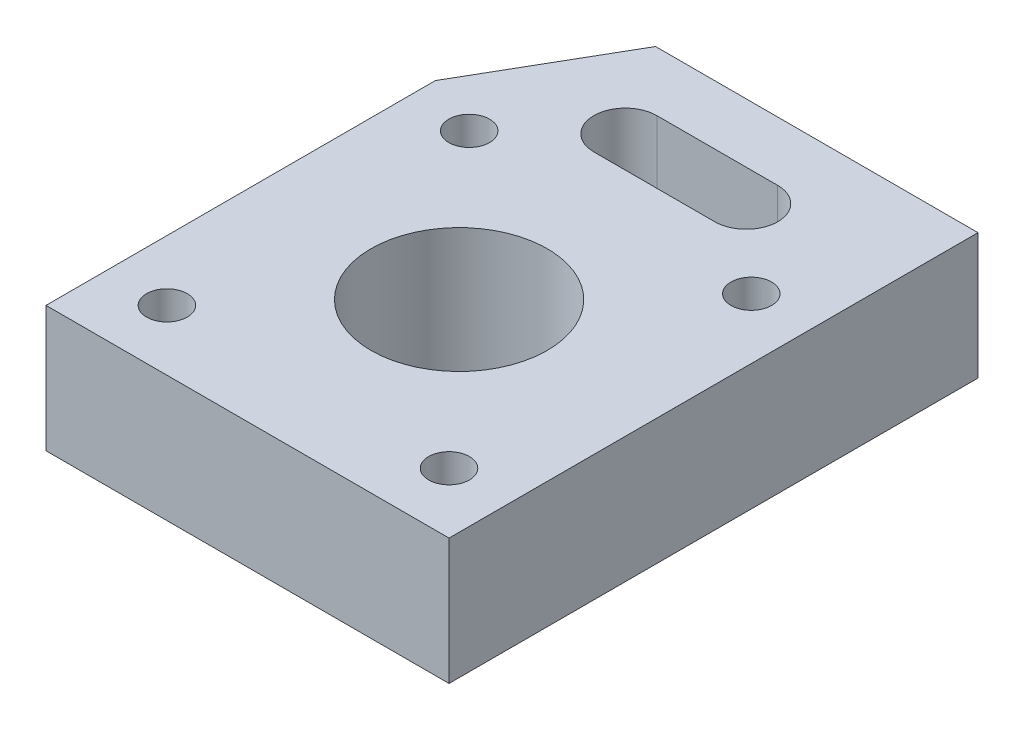
ISO-10303-21;
HEADER;
FILE_DESCRIPTION(('STEP AP214'),'2;1');
FILE_NAME('part.step','',(''),(''),'','','');
FILE_SCHEMA(('AUTOMOTIVE_DESIGN { 1 0 10303 214 1 1 1 1 }'));
ENDSEC;
DATA;
#1=APPLICATION_CONTEXT('core data for automotive mechanical design processes');
#2=APPLICATION_PROTOCOL_DEFINITION('international standard','automotive_design',2000,#1);
#3=PRODUCT_CONTEXT('',#1,'mechanical');
#4=PRODUCT('Part','Part','',(#3));
#5=PRODUCT_RELATED_PRODUCT_CATEGORY('part','',(#4));
#6=PRODUCT_DEFINITION_FORMATION('','',#4);
#7=PRODUCT_DEFINITION_CONTEXT('part definition',#1,'design');
#8=PRODUCT_DEFINITION('design','',#6,#7);
#9=PRODUCT_DEFINITION_SHAPE('','',#8);
#10=(LENGTH_UNIT() NAMED_UNIT(*) SI_UNIT(.MILLI.,.METRE.));
#11=(NAMED_UNIT(*) PLANE_ANGLE_UNIT() SI_UNIT($,.RADIAN.));
#12=(NAMED_UNIT(*) SI_UNIT($,.STERADIAN.) SOLID_ANGLE_UNIT());
#13=UNCERTAINTY_MEASURE_WITH_UNIT(LENGTH_MEASURE(1.E-05),#10,'distance_accuracy_value','');
#14=(GEOMETRIC_REPRESENTATION_CONTEXT(3) GLOBAL_UNCERTAINTY_ASSIGNED_CONTEXT((#13)) GLOBAL_UNIT_ASSIGNED_CONTEXT((#10,
#11,#12)) REPRESENTATION_CONTEXT('',''));
#15=CARTESIAN_POINT('',(0.,0.,0.));
#16=DIRECTION('',(0.,0.,1.));
#17=DIRECTION('',(1.,0.,0.));
#18=AXIS2_PLACEMENT_3D('',#15,#16,#17);
#19=CARTESIAN_POINT('',(0.,31.75,0.));
#20=DIRECTION('',(0.,-1.,0.));
#21=DIRECTION('',(0.,0.,-1.));
#22=AXIS2_PLACEMENT_3D('',#19,#20,#21);
#23=PLANE('',#22);
#24=CARTESIAN_POINT('',(35.56,31.75,38.1));
#25=DIRECTION('',(0.,1.,0.));
#26=DIRECTION('',(0.,0.,1.));
#27=AXIS2_PLACEMENT_3D('',#24,#25,#26);
#28=CIRCLE('',#27,5.1308);
#29=CARTESIAN_POINT('',(35.56,31.75,43.2308));
#30=VERTEX_POINT('',#29);
#31=EDGE_CURVE('E167',#30,#30,#28,.T.);
#32=ORIENTED_EDGE('',*,*,#31,.F.);
#33=EDGE_LOOP('',(#32));
#34=FACE_BOUND('',#33,.T.);
#35=CARTESIAN_POINT('',(-35.56,31.75,38.1));
#36=DIRECTION('',(0.,1.,0.));
#37=DIRECTION('',(0.,0.,1.));
#38=AXIS2_PLACEMENT_3D('',#35,#36,#37);
#39=CIRCLE('',#38,5.1308);
#40=CARTESIAN_POINT('',(-35.56,31.75,43.2308));
#41=VERTEX_POINT('',#40);
#42=EDGE_CURVE('E175',#41,#41,#39,.T.);
#43=ORIENTED_EDGE('',*,*,#42,.F.);
#44=EDGE_LOOP('',(#43));
#45=FACE_BOUND('',#44,.T.);
#46=CARTESIAN_POINT('',(-35.56,31.75,-38.1));
#47=DIRECTION('',(0.,1.,0.));
#48=DIRECTION('',(0.,0.,1.));
#49=AXIS2_PLACEMENT_3D('',#46,#47,#48);
#50=CIRCLE('',#49,5.1308);
#51=CARTESIAN_POINT('',(-35.56,31.75,-32.9692));
#52=VERTEX_POINT('',#51);
#53=EDGE_CURVE('E182',#52,#52,#50,.T.);
#54=ORIENTED_EDGE('',*,*,#53,.F.);
#55=EDGE_LOOP('',(#54));
#56=FACE_BOUND('',#55,.T.);
#57=CARTESIAN_POINT('',(35.56,31.75,-38.1));
#58=DIRECTION('',(0.,1.,0.));
#59=DIRECTION('',(0.,0.,1.));
#60=AXIS2_PLACEMENT_3D('',#57,#58,#59);
#61=CIRCLE('',#60,5.1308);
#62=CARTESIAN_POINT('',(35.56,31.75,-32.9692));
#63=VERTEX_POINT('',#62);
#64=EDGE_CURVE('E190',#63,#63,#61,.T.);
#65=ORIENTED_EDGE('',*,*,#64,.F.);
#66=EDGE_LOOP('',(#65));
#67=FACE_BOUND('',#66,.T.);
#68=CARTESIAN_POINT('',(0.,31.75,0.));
#69=DIRECTION('',(0.,1.,0.));
#70=DIRECTION('',(0.,0.,1.));
#71=AXIS2_PLACEMENT_3D('',#68,#69,#70);
#72=CIRCLE('',#71,22.225);
#73=CARTESIAN_POINT('',(0.,31.75,22.225));
#74=VERTEX_POINT('',#73);
#75=EDGE_CURVE('E198',#74,#74,#72,.T.);
#76=ORIENTED_EDGE('',*,*,#75,.F.);
#77=EDGE_LOOP('',(#76));
#78=FACE_BOUND('',#77,.T.);
#79=DIRECTION('',(-0.499999999999998,0.,0.86602540378444));
#80=VECTOR('',#79,1.);
#81=CARTESIAN_POINT('',(-50.8,31.75,-44.8147275902002));
#82=LINE('',#81,#80);
#83=CARTESIAN_POINT('',(-30.48,31.75,-80.01));
#84=VERTEX_POINT('',#83);
#85=CARTESIAN_POINT('',(-50.8,31.75,-44.8147275902002));
#86=VERTEX_POINT('',#85);
#87=EDGE_CURVE('E206',#84,#86,#82,.T.);
#88=ORIENTED_EDGE('',*,*,#87,.T.);
#89=DIRECTION('',(0.,0.,1.));
#90=VECTOR('',#89,1.);
#91=CARTESIAN_POINT('',(-50.8,31.75,53.34));
#92=LINE('',#91,#90);
#93=CARTESIAN_POINT('',(-50.8,31.75,53.34));
#94=VERTEX_POINT('',#93);
#95=EDGE_CURVE('E210',#86,#94,#92,.T.);
#96=ORIENTED_EDGE('',*,*,#95,.T.);
#97=DIRECTION('',(1.,0.,0.));
#98=VECTOR('',#97,1.);
#99=CARTESIAN_POINT('',(50.8,31.75,53.34));
#100=LINE('',#99,#98);
#101=CARTESIAN_POINT('',(50.8,31.75,53.34));
#102=VERTEX_POINT('',#101);
#103=EDGE_CURVE('E214',#94,#102,#100,.T.);
#104=ORIENTED_EDGE('',*,*,#103,.T.);
#105=DIRECTION('',(0.,0.,-1.));
#106=VECTOR('',#105,1.);
#107=CARTESIAN_POINT('',(50.8,31.75,-80.01));
#108=LINE('',#107,#106);
#109=CARTESIAN_POINT('',(50.8,31.75,-80.01));
#110=VERTEX_POINT('',#109);
#111=EDGE_CURVE('E217',#102,#110,#108,.T.);
#112=ORIENTED_EDGE('',*,*,#111,.T.);
#113=DIRECTION('',(-1.,0.,0.));
#114=VECTOR('',#113,1.);
#115=CARTESIAN_POINT('',(-30.48,31.75,-80.01));
#116=LINE('',#115,#114);
#117=EDGE_CURVE('E220',#110,#84,#116,.T.);
#118=ORIENTED_EDGE('',*,*,#117,.T.);
#119=EDGE_LOOP('',(#88,#96,#104,#112,#118));
#120=FACE_BOUND('',#119,.T.);
#121=CARTESIAN_POINT('',(-15.24,31.75,-57.15));
#122=DIRECTION('',(0.,1.,0.));
#123=DIRECTION('',(0.,0.,1.));
#124=AXIS2_PLACEMENT_3D('',#121,#122,#123);
#125=CIRCLE('',#124,7.9375);
#126=CARTESIAN_POINT('',(-15.24,31.75,-65.0875));
#127=VERTEX_POINT('',#126);
#128=CARTESIAN_POINT('',(-15.24,31.75,-49.2125));
#129=VERTEX_POINT('',#128);
#130=EDGE_CURVE('E117',#127,#129,#125,.T.);
#131=ORIENTED_EDGE('',*,*,#130,.F.);
#132=DIRECTION('',(-1.,0.,0.));
#133=VECTOR('',#132,1.);
#134=CARTESIAN_POINT('',(-15.24,31.75,-65.0875));
#135=LINE('',#134,#133);
#136=CARTESIAN_POINT('',(15.24,31.75,-65.0875));
#137=VERTEX_POINT('',#136);
#138=EDGE_CURVE('E145',#137,#127,#135,.T.);
#139=ORIENTED_EDGE('',*,*,#138,.F.);
#140=CARTESIAN_POINT('',(15.24,31.75,-57.15));
#141=DIRECTION('',(0.,1.,0.));
#142=DIRECTION('',(0.,0.,1.));
#143=AXIS2_PLACEMENT_3D('',#140,#141,#142);
#144=CIRCLE('',#143,7.9375);
#145=CARTESIAN_POINT('',(15.24,31.75,-49.2125));
#146=VERTEX_POINT('',#145);
#147=EDGE_CURVE('E139',#146,#137,#144,.T.);
#148=ORIENTED_EDGE('',*,*,#147,.F.);
#149=DIRECTION('',(1.,0.,0.));
#150=VECTOR('',#149,1.);
#151=CARTESIAN_POINT('',(15.24,31.75,-49.2125));
#152=LINE('',#151,#150);
#153=EDGE_CURVE('E126',#129,#146,#152,.T.);
#154=ORIENTED_EDGE('',*,*,#153,.F.);
#155=EDGE_LOOP('',(#131,#139,#148,#154));
#156=FACE_BOUND('',#155,.T.);
#157=ADVANCED_FACE('F45',(#34,#45,#56,#67,#78,#120,#156),#23,.F.);
#158=CARTESIAN_POINT('',(0.,0.,0.));
#159=DIRECTION('',(0.,-1.,0.));
#160=DIRECTION('',(0.,0.,-1.));
#161=AXIS2_PLACEMENT_3D('',#158,#159,#160);
#162=PLANE('',#161);
#163=CARTESIAN_POINT('',(-35.56,0.,38.1));
#164=DIRECTION('',(0.,1.,0.));
#165=DIRECTION('',(0.,0.,1.));
#166=AXIS2_PLACEMENT_3D('',#163,#164,#165);
#167=CIRCLE('',#166,5.1308);
#168=CARTESIAN_POINT('',(-35.56,0.,43.2308));
#169=VERTEX_POINT('',#168);
#170=EDGE_CURVE('E171',#169,#169,#167,.T.);
#171=ORIENTED_EDGE('',*,*,#170,.T.);
#172=EDGE_LOOP('',(#171));
#173=FACE_BOUND('',#172,.T.);
#174=CARTESIAN_POINT('',(35.56,0.,-38.1));
#175=DIRECTION('',(0.,1.,0.));
#176=DIRECTION('',(0.,0.,1.));
#177=AXIS2_PLACEMENT_3D('',#174,#175,#176);
#178=CIRCLE('',#177,5.1308);
#179=CARTESIAN_POINT('',(35.56,0.,-32.9692));
#180=VERTEX_POINT('',#179);
#181=EDGE_CURVE('E186',#180,#180,#178,.T.);
#182=ORIENTED_EDGE('',*,*,#181,.T.);
#183=EDGE_LOOP('',(#182));
#184=FACE_BOUND('',#183,.T.);
#185=DIRECTION('',(-0.499999999999998,0.,0.86602540378444));
#186=VECTOR('',#185,1.);
#187=CARTESIAN_POINT('',(-50.8,0.,-44.8147275902002));
#188=LINE('',#187,#186);
#189=CARTESIAN_POINT('',(-30.48,0.,-80.01));
#190=VERTEX_POINT('',#189);
#191=CARTESIAN_POINT('',(-50.8,0.,-44.8147275902002));
#192=VERTEX_POINT('',#191);
#193=EDGE_CURVE('E202',#190,#192,#188,.T.);
#194=ORIENTED_EDGE('',*,*,#193,.F.);
#195=DIRECTION('',(-1.,0.,0.));
#196=VECTOR('',#195,1.);
#197=CARTESIAN_POINT('',(-30.48,0.,-80.01));
#198=LINE('',#197,#196);
#199=CARTESIAN_POINT('',(50.8,0.,-80.01));
#200=VERTEX_POINT('',#199);
#201=EDGE_CURVE('E211',#200,#190,#198,.T.);
#202=ORIENTED_EDGE('',*,*,#201,.F.);
#203=DIRECTION('',(0.,0.,-1.));
#204=VECTOR('',#203,1.);
#205=CARTESIAN_POINT('',(50.8,0.,-80.01));
#206=LINE('',#205,#204);
#207=CARTESIAN_POINT('',(50.8,0.,53.34));
#208=VERTEX_POINT('',#207);
#209=EDGE_CURVE('E233',#208,#200,#206,.T.);
#210=ORIENTED_EDGE('',*,*,#209,.F.);
#211=DIRECTION('',(1.,0.,0.));
#212=VECTOR('',#211,1.);
#213=CARTESIAN_POINT('',(50.8,0.,53.34));
#214=LINE('',#213,#212);
#215=CARTESIAN_POINT('',(-50.8,0.,53.34));
#216=VERTEX_POINT('',#215);
#217=EDGE_CURVE('E230',#216,#208,#214,.T.);
#218=ORIENTED_EDGE('',*,*,#217,.F.);
#219=DIRECTION('',(0.,0.,1.));
#220=VECTOR('',#219,1.);
#221=CARTESIAN_POINT('',(-50.8,0.,53.34));
#222=LINE('',#221,#220);
#223=EDGE_CURVE('E227',#192,#216,#222,.T.);
#224=ORIENTED_EDGE('',*,*,#223,.F.);
#225=EDGE_LOOP('',(#194,#202,#210,#218,#224));
#226=FACE_BOUND('',#225,.T.);
#227=CARTESIAN_POINT('',(0.,0.,0.));
#228=DIRECTION('',(0.,1.,0.));
#229=DIRECTION('',(0.,0.,1.));
#230=AXIS2_PLACEMENT_3D('',#227,#228,#229);
#231=CIRCLE('',#230,22.225);
#232=CARTESIAN_POINT('',(0.,0.,22.225));
#233=VERTEX_POINT('',#232);
#234=EDGE_CURVE('E194',#233,#233,#231,.T.);
#235=ORIENTED_EDGE('',*,*,#234,.T.);
#236=EDGE_LOOP('',(#235));
#237=FACE_BOUND('',#236,.T.);
#238=CARTESIAN_POINT('',(-35.56,0.,-38.1));
#239=DIRECTION('',(0.,1.,0.));
#240=DIRECTION('',(0.,0.,1.));
#241=AXIS2_PLACEMENT_3D('',#238,#239,#240);
#242=CIRCLE('',#241,5.1308);
#243=CARTESIAN_POINT('',(-35.56,0.,-32.9692));
#244=VERTEX_POINT('',#243);
#245=EDGE_CURVE('E179',#244,#244,#242,.T.);
#246=ORIENTED_EDGE('',*,*,#245,.T.);
#247=EDGE_LOOP('',(#246));
#248=FACE_BOUND('',#247,.T.);
#249=CARTESIAN_POINT('',(35.56,0.,38.1));
#250=DIRECTION('',(0.,1.,0.));
#251=DIRECTION('',(0.,0.,1.));
#252=AXIS2_PLACEMENT_3D('',#249,#250,#251);
#253=CIRCLE('',#252,5.1308);
#254=CARTESIAN_POINT('',(35.56,0.,43.2308));
#255=VERTEX_POINT('',#254);
#256=EDGE_CURVE('E135',#255,#255,#253,.T.);
#257=ORIENTED_EDGE('',*,*,#256,.T.);
#258=EDGE_LOOP('',(#257));
#259=FACE_BOUND('',#258,.T.);
#260=DIRECTION('',(-1.,0.,0.));
#261=VECTOR('',#260,1.);
#262=CARTESIAN_POINT('',(-15.24,0.,-65.0875));
#263=LINE('',#262,#261);
#264=CARTESIAN_POINT('',(15.24,0.,-65.0875));
#265=VERTEX_POINT('',#264);
#266=CARTESIAN_POINT('',(-15.24,0.,-65.0875));
#267=VERTEX_POINT('',#266);
#268=EDGE_CURVE('E127',#265,#267,#263,.T.);
#269=ORIENTED_EDGE('',*,*,#268,.T.);
#270=CARTESIAN_POINT('',(-15.24,0.,-57.15));
#271=DIRECTION('',(0.,1.,0.));
#272=DIRECTION('',(0.,0.,1.));
#273=AXIS2_PLACEMENT_3D('',#270,#271,#272);
#274=CIRCLE('',#273,7.9375);
#275=CARTESIAN_POINT('',(-15.24,0.,-49.2125));
#276=VERTEX_POINT('',#275);
#277=EDGE_CURVE('E69',#267,#276,#274,.T.);
#278=ORIENTED_EDGE('',*,*,#277,.T.);
#279=DIRECTION('',(1.,0.,0.));
#280=VECTOR('',#279,1.);
#281=CARTESIAN_POINT('',(15.24,0.,-49.2125));
#282=LINE('',#281,#280);
#283=CARTESIAN_POINT('',(15.24,0.,-49.2125));
#284=VERTEX_POINT('',#283);
#285=EDGE_CURVE('E133',#276,#284,#282,.T.);
#286=ORIENTED_EDGE('',*,*,#285,.T.);
#287=CARTESIAN_POINT('',(15.24,0.,-57.15));
#288=DIRECTION('',(0.,1.,0.));
#289=DIRECTION('',(0.,0.,1.));
#290=AXIS2_PLACEMENT_3D('',#287,#288,#289);
#291=CIRCLE('',#290,7.9375);
#292=EDGE_CURVE('E154',#284,#265,#291,.T.);
#293=ORIENTED_EDGE('',*,*,#292,.T.);
#294=EDGE_LOOP('',(#269,#278,#286,#293));
#295=FACE_BOUND('',#294,.T.);
#296=ADVANCED_FACE('F261',(#173,#184,#226,#237,#248,#259,#295),#162,.T.);
#297=CARTESIAN_POINT('',(-50.8,31.75,-44.8147275902002));
#298=DIRECTION('',(0.86602540378444,0.,0.499999999999998));
#299=DIRECTION('',(0.499999999999998,0.,-0.86602540378444));
#300=AXIS2_PLACEMENT_3D('',#297,#298,#299);
#301=PLANE('',#300);
#302=ORIENTED_EDGE('',*,*,#193,.T.);
#303=DIRECTION('',(0.,-1.,0.));
#304=VECTOR('',#303,1.);
#305=CARTESIAN_POINT('',(-50.8,31.75,-44.8147275902002));
#306=LINE('',#305,#304);
#307=EDGE_CURVE('E11',#86,#192,#306,.T.);
#308=ORIENTED_EDGE('',*,*,#307,.F.);
#309=ORIENTED_EDGE('',*,*,#87,.F.);
#310=DIRECTION('',(0.,-1.,0.));
#311=VECTOR('',#310,1.);
#312=CARTESIAN_POINT('',(-30.48,31.75,-80.01));
#313=LINE('',#312,#311);
#314=EDGE_CURVE('E223',#84,#190,#313,.T.);
#315=ORIENTED_EDGE('',*,*,#314,.T.);
#316=EDGE_LOOP('',(#302,#308,#309,#315));
#317=FACE_BOUND('',#316,.T.);
#318=ADVANCED_FACE('F47',(#317),#301,.F.);
#319=CARTESIAN_POINT('',(-50.8,31.75,53.34));
#320=DIRECTION('',(1.,0.,0.));
#321=DIRECTION('',(0.,0.,-1.));
#322=AXIS2_PLACEMENT_3D('',#319,#320,#321);
#323=PLANE('',#322);
#324=ORIENTED_EDGE('',*,*,#223,.T.);
#325=DIRECTION('',(0.,-1.,0.));
#326=VECTOR('',#325,1.);
#327=CARTESIAN_POINT('',(-50.8,31.75,53.34));
#328=LINE('',#327,#326);
#329=EDGE_CURVE('E54',#94,#216,#328,.T.);
#330=ORIENTED_EDGE('',*,*,#329,.F.);
#331=ORIENTED_EDGE('',*,*,#95,.F.);
#332=ORIENTED_EDGE('',*,*,#307,.T.);
#333=EDGE_LOOP('',(#324,#330,#331,#332));
#334=FACE_BOUND('',#333,.T.);
#335=ADVANCED_FACE('F275',(#334),#323,.F.);
#336=CARTESIAN_POINT('',(50.8,31.75,53.34));
#337=DIRECTION('',(0.,0.,-1.));
#338=DIRECTION('',(-1.,0.,0.));
#339=AXIS2_PLACEMENT_3D('',#336,#337,#338);
#340=PLANE('',#339);
#341=ORIENTED_EDGE('',*,*,#217,.T.);
#342=DIRECTION('',(0.,-1.,0.));
#343=VECTOR('',#342,1.);
#344=CARTESIAN_POINT('',(50.8,31.75,53.34));
#345=LINE('',#344,#343);
#346=EDGE_CURVE('E245',#102,#208,#345,.T.);
#347=ORIENTED_EDGE('',*,*,#346,.F.);
#348=ORIENTED_EDGE('',*,*,#103,.F.);
#349=ORIENTED_EDGE('',*,*,#329,.T.);
#350=EDGE_LOOP('',(#341,#347,#348,#349));
#351=FACE_BOUND('',#350,.T.);
#352=ADVANCED_FACE('F255',(#351),#340,.F.);
#353=CARTESIAN_POINT('',(50.8,31.75,-80.01));
#354=DIRECTION('',(-1.,0.,0.));
#355=DIRECTION('',(0.,0.,1.));
#356=AXIS2_PLACEMENT_3D('',#353,#354,#355);
#357=PLANE('',#356);
#358=ORIENTED_EDGE('',*,*,#209,.T.);
#359=DIRECTION('',(0.,-1.,0.));
#360=VECTOR('',#359,1.);
#361=CARTESIAN_POINT('',(50.8,31.75,-80.01));
#362=LINE('',#361,#360);
#363=EDGE_CURVE('E241',#110,#200,#362,.T.);
#364=ORIENTED_EDGE('',*,*,#363,.F.);
#365=ORIENTED_EDGE('',*,*,#111,.F.);
#366=ORIENTED_EDGE('',*,*,#346,.T.);
#367=EDGE_LOOP('',(#358,#364,#365,#366));
#368=FACE_BOUND('',#367,.T.);
#369=ADVANCED_FACE('F266',(#368),#357,.F.);
#370=CARTESIAN_POINT('',(-30.48,31.75,-80.01));
#371=DIRECTION('',(0.,0.,1.));
#372=DIRECTION('',(1.,0.,0.));
#373=AXIS2_PLACEMENT_3D('',#370,#371,#372);
#374=PLANE('',#373);
#375=ORIENTED_EDGE('',*,*,#201,.T.);
#376=ORIENTED_EDGE('',*,*,#314,.F.);
#377=ORIENTED_EDGE('',*,*,#117,.F.);
#378=ORIENTED_EDGE('',*,*,#363,.T.);
#379=EDGE_LOOP('',(#375,#376,#377,#378));
#380=FACE_BOUND('',#379,.T.);
#381=ADVANCED_FACE('F270',(#380),#374,.F.);
#382=CARTESIAN_POINT('',(0.,31.75,0.));
#383=DIRECTION('',(0.,-1.,0.));
#384=DIRECTION('',(0.,0.,-1.));
#385=AXIS2_PLACEMENT_3D('',#382,#383,#384);
#386=CYLINDRICAL_SURFACE('',#385,22.225);
#387=ORIENTED_EDGE('',*,*,#75,.T.);
#388=EDGE_LOOP('',(#387));
#389=FACE_BOUND('',#388,.T.);
#390=ORIENTED_EDGE('',*,*,#234,.F.);
#391=EDGE_LOOP('',(#390));
#392=FACE_BOUND('',#391,.T.);
#393=ADVANCED_FACE('F292',(#389,#392),#386,.F.);
#394=CARTESIAN_POINT('',(35.56,31.75,-38.1));
#395=DIRECTION('',(0.,-1.,0.));
#396=DIRECTION('',(0.,0.,-1.));
#397=AXIS2_PLACEMENT_3D('',#394,#395,#396);
#398=CYLINDRICAL_SURFACE('',#397,5.1308);
#399=ORIENTED_EDGE('',*,*,#64,.T.);
#400=EDGE_LOOP('',(#399));
#401=FACE_BOUND('',#400,.T.);
#402=ORIENTED_EDGE('',*,*,#181,.F.);
#403=EDGE_LOOP('',(#402));
#404=FACE_BOUND('',#403,.T.);
#405=ADVANCED_FACE('F321',(#401,#404),#398,.F.);
#406=CARTESIAN_POINT('',(-35.56,31.75,-38.1));
#407=DIRECTION('',(0.,-1.,0.));
#408=DIRECTION('',(0.,0.,-1.));
#409=AXIS2_PLACEMENT_3D('',#406,#407,#408);
#410=CYLINDRICAL_SURFACE('',#409,5.1308);
#411=ORIENTED_EDGE('',*,*,#53,.T.);
#412=EDGE_LOOP('',(#411));
#413=FACE_BOUND('',#412,.T.);
#414=ORIENTED_EDGE('',*,*,#245,.F.);
#415=EDGE_LOOP('',(#414));
#416=FACE_BOUND('',#415,.T.);
#417=ADVANCED_FACE('F329',(#413,#416),#410,.F.);
#418=CARTESIAN_POINT('',(-35.56,31.75,38.1));
#419=DIRECTION('',(0.,-1.,0.));
#420=DIRECTION('',(0.,0.,-1.));
#421=AXIS2_PLACEMENT_3D('',#418,#419,#420);
#422=CYLINDRICAL_SURFACE('',#421,5.1308);
#423=ORIENTED_EDGE('',*,*,#42,.T.);
#424=EDGE_LOOP('',(#423));
#425=FACE_BOUND('',#424,.T.);
#426=ORIENTED_EDGE('',*,*,#170,.F.);
#427=EDGE_LOOP('',(#426));
#428=FACE_BOUND('',#427,.T.);
#429=ADVANCED_FACE('F337',(#425,#428),#422,.F.);
#430=CARTESIAN_POINT('',(35.56,31.75,38.1));
#431=DIRECTION('',(0.,-1.,0.));
#432=DIRECTION('',(0.,0.,-1.));
#433=AXIS2_PLACEMENT_3D('',#430,#431,#432);
#434=CYLINDRICAL_SURFACE('',#433,5.1308);
#435=ORIENTED_EDGE('',*,*,#31,.T.);
#436=EDGE_LOOP('',(#435));
#437=FACE_BOUND('',#436,.T.);
#438=ORIENTED_EDGE('',*,*,#256,.F.);
#439=EDGE_LOOP('',(#438));
#440=FACE_BOUND('',#439,.T.);
#441=ADVANCED_FACE('F346',(#437,#440),#434,.F.);
#442=CARTESIAN_POINT('',(-15.24,31.75,-57.15));
#443=DIRECTION('',(0.,-1.,0.));
#444=DIRECTION('',(0.,0.,-1.));
#445=AXIS2_PLACEMENT_3D('',#442,#443,#444);
#446=CYLINDRICAL_SURFACE('',#445,7.9375);
#447=ORIENTED_EDGE('',*,*,#277,.F.);
#448=DIRECTION('',(0.,-1.,0.));
#449=VECTOR('',#448,1.);
#450=CARTESIAN_POINT('',(-15.24,31.75,-65.0875));
#451=LINE('',#450,#449);
#452=EDGE_CURVE('E121',#127,#267,#451,.T.);
#453=ORIENTED_EDGE('',*,*,#452,.F.);
#454=ORIENTED_EDGE('',*,*,#130,.T.);
#455=DIRECTION('',(0.,-1.,0.));
#456=VECTOR('',#455,1.);
#457=CARTESIAN_POINT('',(-15.24,31.75,-49.2125));
#458=LINE('',#457,#456);
#459=EDGE_CURVE('E120',#129,#276,#458,.T.);
#460=ORIENTED_EDGE('',*,*,#459,.T.);
#461=EDGE_LOOP('',(#447,#453,#454,#460));
#462=FACE_BOUND('',#461,.T.);
#463=ADVANCED_FACE('F119',(#462),#446,.F.);
#464=CARTESIAN_POINT('',(15.24,31.75,-49.2125));
#465=DIRECTION('',(0.,0.,-1.));
#466=DIRECTION('',(-1.,0.,0.));
#467=AXIS2_PLACEMENT_3D('',#464,#465,#466);
#468=PLANE('',#467);
#469=ORIENTED_EDGE('',*,*,#285,.F.);
#470=ORIENTED_EDGE('',*,*,#459,.F.);
#471=ORIENTED_EDGE('',*,*,#153,.T.);
#472=DIRECTION('',(0.,-1.,0.));
#473=VECTOR('',#472,1.);
#474=CARTESIAN_POINT('',(15.24,31.75,-49.2125));
#475=LINE('',#474,#473);
#476=EDGE_CURVE('E136',#146,#284,#475,.T.);
#477=ORIENTED_EDGE('',*,*,#476,.T.);
#478=EDGE_LOOP('',(#469,#470,#471,#477));
#479=FACE_BOUND('',#478,.T.);
#480=ADVANCED_FACE('F130',(#479),#468,.T.);
#481=CARTESIAN_POINT('',(15.24,31.75,-57.15));
#482=DIRECTION('',(0.,-1.,0.));
#483=DIRECTION('',(0.,0.,-1.));
#484=AXIS2_PLACEMENT_3D('',#481,#482,#483);
#485=CYLINDRICAL_SURFACE('',#484,7.9375);
#486=ORIENTED_EDGE('',*,*,#292,.F.);
#487=ORIENTED_EDGE('',*,*,#476,.F.);
#488=ORIENTED_EDGE('',*,*,#147,.T.);
#489=DIRECTION('',(0.,-1.,0.));
#490=VECTOR('',#489,1.);
#491=CARTESIAN_POINT('',(15.24,31.75,-65.0875));
#492=LINE('',#491,#490);
#493=EDGE_CURVE('E61',#137,#265,#492,.T.);
#494=ORIENTED_EDGE('',*,*,#493,.T.);
#495=EDGE_LOOP('',(#486,#487,#488,#494));
#496=FACE_BOUND('',#495,.T.);
#497=ADVANCED_FACE('F370',(#496),#485,.F.);
#498=CARTESIAN_POINT('',(-15.24,31.75,-65.0875));
#499=DIRECTION('',(0.,0.,1.));
#500=DIRECTION('',(1.,0.,0.));
#501=AXIS2_PLACEMENT_3D('',#498,#499,#500);
#502=PLANE('',#501);
#503=ORIENTED_EDGE('',*,*,#268,.F.);
#504=ORIENTED_EDGE('',*,*,#493,.F.);
#505=ORIENTED_EDGE('',*,*,#138,.T.);
#506=ORIENTED_EDGE('',*,*,#452,.T.);
#507=EDGE_LOOP('',(#503,#504,#505,#506));
#508=FACE_BOUND('',#507,.T.);
#509=ADVANCED_FACE('F378',(#508),#502,.T.);
#510=CLOSED_SHELL('',(#157,#296,#318,#335,#352,#369,#381,#393,#405,#417,#429,#441,#463,#480,
#497,#509));
#511=MANIFOLD_SOLID_BREP('B2',#510);
#512=ADVANCED_BREP_SHAPE_REPRESENTATION('',(#18,#511),#14);
#513=SHAPE_DEFINITION_REPRESENTATION(#9,#512);
ENDSEC;
END-ISO-10303-21;
